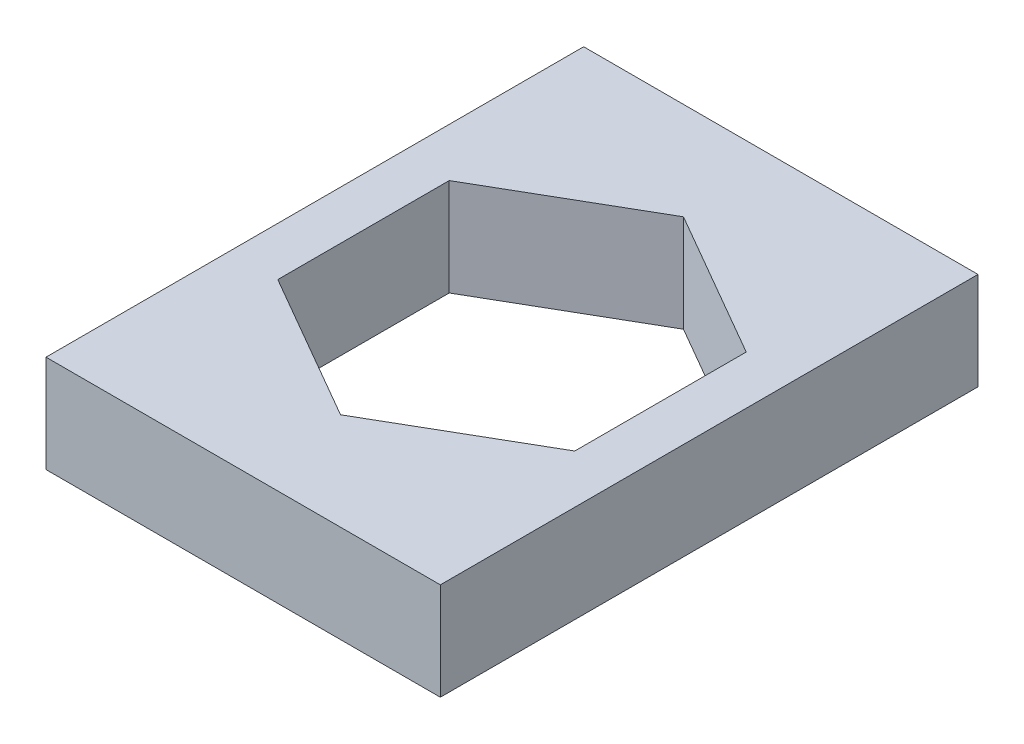
ISO-10303-21;
HEADER;
FILE_DESCRIPTION(('STEP AP214'),'2;1');
FILE_NAME('part.step','',(''),(''),'','','');
FILE_SCHEMA(('AUTOMOTIVE_DESIGN { 1 0 10303 214 1 1 1 1 }'));
ENDSEC;
DATA;
#1=APPLICATION_CONTEXT('core data for automotive mechanical design processes');
#2=APPLICATION_PROTOCOL_DEFINITION('international standard','automotive_design',2000,#1);
#3=PRODUCT_CONTEXT('',#1,'mechanical');
#4=PRODUCT('Part','Part','',(#3));
#5=PRODUCT_RELATED_PRODUCT_CATEGORY('part','',(#4));
#6=PRODUCT_DEFINITION_FORMATION('','',#4);
#7=PRODUCT_DEFINITION_CONTEXT('part definition',#1,'design');
#8=PRODUCT_DEFINITION('design','',#6,#7);
#9=PRODUCT_DEFINITION_SHAPE('','',#8);
#10=(LENGTH_UNIT() NAMED_UNIT(*) SI_UNIT(.MILLI.,.METRE.));
#11=(NAMED_UNIT(*) PLANE_ANGLE_UNIT() SI_UNIT($,.RADIAN.));
#12=(NAMED_UNIT(*) SI_UNIT($,.STERADIAN.) SOLID_ANGLE_UNIT());
#13=UNCERTAINTY_MEASURE_WITH_UNIT(LENGTH_MEASURE(1.E-05),#10,'distance_accuracy_value','');
#14=(GEOMETRIC_REPRESENTATION_CONTEXT(3) GLOBAL_UNCERTAINTY_ASSIGNED_CONTEXT((#13)) GLOBAL_UNIT_ASSIGNED_CONTEXT((#10,
#11,#12)) REPRESENTATION_CONTEXT('',''));
#15=CARTESIAN_POINT('',(0.,0.,0.));
#16=DIRECTION('',(0.,0.,1.));
#17=DIRECTION('',(1.,0.,0.));
#18=AXIS2_PLACEMENT_3D('',#15,#16,#17);
#19=CARTESIAN_POINT('',(0.,4.,0.));
#20=DIRECTION('',(0.,-1.,0.));
#21=DIRECTION('',(0.,0.,-1.));
#22=AXIS2_PLACEMENT_3D('',#19,#20,#21);
#23=PLANE('',#22);
#24=DIRECTION('',(0.,0.,1.));
#25=VECTOR('',#24,1.);
#26=CARTESIAN_POINT('',(-8.1,4.,-4.67653718043597));
#27=LINE('',#26,#25);
#28=CARTESIAN_POINT('',(-8.1,4.,-11.0436732841134));
#29=VERTEX_POINT('',#28);
#30=CARTESIAN_POINT('',(-8.1,4.,11.0436732841134));
#31=VERTEX_POINT('',#30);
#32=EDGE_CURVE('E164',#29,#31,#27,.T.);
#33=ORIENTED_EDGE('',*,*,#32,.T.);
#34=DIRECTION('',(1.,0.,0.));
#35=VECTOR('',#34,1.);
#36=CARTESIAN_POINT('',(-8.1,4.,11.0436732841134));
#37=LINE('',#36,#35);
#38=CARTESIAN_POINT('',(8.1,4.,11.0436732841134));
#39=VERTEX_POINT('',#38);
#40=EDGE_CURVE('E166',#31,#39,#37,.T.);
#41=ORIENTED_EDGE('',*,*,#40,.T.);
#42=DIRECTION('',(0.,0.,-1.));
#43=VECTOR('',#42,1.);
#44=CARTESIAN_POINT('',(8.1,4.,11.0436732841134));
#45=LINE('',#44,#43);
#46=CARTESIAN_POINT('',(8.1,4.,-11.0436732841134));
#47=VERTEX_POINT('',#46);
#48=EDGE_CURVE('E169',#39,#47,#45,.T.);
#49=ORIENTED_EDGE('',*,*,#48,.T.);
#50=DIRECTION('',(-1.,0.,0.));
#51=VECTOR('',#50,1.);
#52=CARTESIAN_POINT('',(-8.1,4.,-11.0436732841134));
#53=LINE('',#52,#51);
#54=EDGE_CURVE('E171',#47,#29,#53,.T.);
#55=ORIENTED_EDGE('',*,*,#54,.T.);
#56=EDGE_LOOP('',(#33,#41,#49,#55));
#57=FACE_BOUND('',#56,.T.);
#58=DIRECTION('',(-0.866025403784439,0.,-0.5));
#59=VECTOR('',#58,1.);
#60=CARTESIAN_POINT('',(6.1,4.,-3.52183664205672));
#61=LINE('',#60,#59);
#62=CARTESIAN_POINT('',(6.1,4.,-3.52183664205672));
#63=VERTEX_POINT('',#62);
#64=CARTESIAN_POINT('',(0.,4.,-7.04367328411343));
#65=VERTEX_POINT('',#64);
#66=EDGE_CURVE('E113',#63,#65,#61,.T.);
#67=ORIENTED_EDGE('',*,*,#66,.F.);
#68=DIRECTION('',(0.,0.,-1.));
#69=VECTOR('',#68,1.);
#70=CARTESIAN_POINT('',(6.1,4.,3.52183664205672));
#71=LINE('',#70,#69);
#72=CARTESIAN_POINT('',(6.1,4.,3.52183664205672));
#73=VERTEX_POINT('',#72);
#74=EDGE_CURVE('E142',#73,#63,#71,.T.);
#75=ORIENTED_EDGE('',*,*,#74,.F.);
#76=DIRECTION('',(0.866025403784439,0.,-0.5));
#77=VECTOR('',#76,1.);
#78=CARTESIAN_POINT('',(0.,4.,7.04367328411343));
#79=LINE('',#78,#77);
#80=CARTESIAN_POINT('',(0.,4.,7.04367328411343));
#81=VERTEX_POINT('',#80);
#82=EDGE_CURVE('E140',#81,#73,#79,.T.);
#83=ORIENTED_EDGE('',*,*,#82,.F.);
#84=DIRECTION('',(0.866025403784438,0.,0.5));
#85=VECTOR('',#84,1.);
#86=CARTESIAN_POINT('',(-6.1,4.,3.52183664205672));
#87=LINE('',#86,#85);
#88=CARTESIAN_POINT('',(-6.1,4.,3.52183664205672));
#89=VERTEX_POINT('',#88);
#90=EDGE_CURVE('E136',#89,#81,#87,.T.);
#91=ORIENTED_EDGE('',*,*,#90,.F.);
#92=DIRECTION('',(0.,0.,1.));
#93=VECTOR('',#92,1.);
#94=CARTESIAN_POINT('',(-6.1,4.,-3.52183664205672));
#95=LINE('',#94,#93);
#96=CARTESIAN_POINT('',(-6.1,4.,-3.52183664205672));
#97=VERTEX_POINT('',#96);
#98=EDGE_CURVE('E134',#97,#89,#95,.T.);
#99=ORIENTED_EDGE('',*,*,#98,.F.);
#100=DIRECTION('',(-0.866025403784439,0.,0.5));
#101=VECTOR('',#100,1.);
#102=CARTESIAN_POINT('',(0.,4.,-7.04367328411343));
#103=LINE('',#102,#101);
#104=EDGE_CURVE('E121',#65,#97,#103,.T.);
#105=ORIENTED_EDGE('',*,*,#104,.F.);
#106=EDGE_LOOP('',(#67,#75,#83,#91,#99,#105));
#107=FACE_BOUND('',#106,.T.);
#108=ADVANCED_FACE('F36',(#57,#107),#23,.F.);
#109=CARTESIAN_POINT('',(0.,0.,0.));
#110=DIRECTION('',(0.,-1.,0.));
#111=DIRECTION('',(0.,0.,-1.));
#112=AXIS2_PLACEMENT_3D('',#109,#110,#111);
#113=PLANE('',#112);
#114=DIRECTION('',(0.,0.,1.));
#115=VECTOR('',#114,1.);
#116=CARTESIAN_POINT('',(-8.1,0.,4.67653718043597));
#117=LINE('',#116,#115);
#118=CARTESIAN_POINT('',(-8.1,0.,-11.0436732841134));
#119=VERTEX_POINT('',#118);
#120=CARTESIAN_POINT('',(-8.1,0.,11.0436732841134));
#121=VERTEX_POINT('',#120);
#122=EDGE_CURVE('E129',#119,#121,#117,.T.);
#123=ORIENTED_EDGE('',*,*,#122,.F.);
#124=DIRECTION('',(-1.,0.,0.));
#125=VECTOR('',#124,1.);
#126=CARTESIAN_POINT('',(-8.1,0.,-11.0436732841134));
#127=LINE('',#126,#125);
#128=CARTESIAN_POINT('',(8.1,0.,-11.0436732841134));
#129=VERTEX_POINT('',#128);
#130=EDGE_CURVE('E167',#129,#119,#127,.T.);
#131=ORIENTED_EDGE('',*,*,#130,.F.);
#132=DIRECTION('',(0.,0.,-1.));
#133=VECTOR('',#132,1.);
#134=CARTESIAN_POINT('',(8.1,0.,-11.0436732841134));
#135=LINE('',#134,#133);
#136=CARTESIAN_POINT('',(8.1,0.,11.0436732841134));
#137=VERTEX_POINT('',#136);
#138=EDGE_CURVE('E178',#137,#129,#135,.T.);
#139=ORIENTED_EDGE('',*,*,#138,.F.);
#140=DIRECTION('',(1.,0.,0.));
#141=VECTOR('',#140,1.);
#142=CARTESIAN_POINT('',(-8.1,0.,11.0436732841134));
#143=LINE('',#142,#141);
#144=EDGE_CURVE('E175',#121,#137,#143,.T.);
#145=ORIENTED_EDGE('',*,*,#144,.F.);
#146=EDGE_LOOP('',(#123,#131,#139,#145));
#147=FACE_BOUND('',#146,.T.);
#148=DIRECTION('',(0.,0.,-1.));
#149=VECTOR('',#148,1.);
#150=CARTESIAN_POINT('',(6.1,0.,3.52183664205672));
#151=LINE('',#150,#149);
#152=CARTESIAN_POINT('',(6.1,0.,3.52183664205672));
#153=VERTEX_POINT('',#152);
#154=CARTESIAN_POINT('',(6.1,0.,-3.52183664205672));
#155=VERTEX_POINT('',#154);
#156=EDGE_CURVE('E122',#153,#155,#151,.T.);
#157=ORIENTED_EDGE('',*,*,#156,.T.);
#158=DIRECTION('',(-0.866025403784439,0.,-0.5));
#159=VECTOR('',#158,1.);
#160=CARTESIAN_POINT('',(6.1,0.,-3.52183664205672));
#161=LINE('',#160,#159);
#162=CARTESIAN_POINT('',(0.,0.,-7.04367328411343));
#163=VERTEX_POINT('',#162);
#164=EDGE_CURVE('E59',#155,#163,#161,.T.);
#165=ORIENTED_EDGE('',*,*,#164,.T.);
#166=DIRECTION('',(-0.866025403784439,0.,0.5));
#167=VECTOR('',#166,1.);
#168=CARTESIAN_POINT('',(0.,0.,-7.04367328411343));
#169=LINE('',#168,#167);
#170=CARTESIAN_POINT('',(-6.1,0.,-3.52183664205672));
#171=VERTEX_POINT('',#170);
#172=EDGE_CURVE('E128',#163,#171,#169,.T.);
#173=ORIENTED_EDGE('',*,*,#172,.T.);
#174=DIRECTION('',(0.,0.,1.));
#175=VECTOR('',#174,1.);
#176=CARTESIAN_POINT('',(-6.1,0.,-3.52183664205672));
#177=LINE('',#176,#175);
#178=CARTESIAN_POINT('',(-6.1,0.,3.52183664205672));
#179=VERTEX_POINT('',#178);
#180=EDGE_CURVE('E146',#171,#179,#177,.T.);
#181=ORIENTED_EDGE('',*,*,#180,.T.);
#182=DIRECTION('',(0.866025403784438,0.,0.5));
#183=VECTOR('',#182,1.);
#184=CARTESIAN_POINT('',(-6.1,0.,3.52183664205672));
#185=LINE('',#184,#183);
#186=CARTESIAN_POINT('',(0.,0.,7.04367328411343));
#187=VERTEX_POINT('',#186);
#188=EDGE_CURVE('E149',#179,#187,#185,.T.);
#189=ORIENTED_EDGE('',*,*,#188,.T.);
#190=DIRECTION('',(0.866025403784439,0.,-0.5));
#191=VECTOR('',#190,1.);
#192=CARTESIAN_POINT('',(0.,0.,7.04367328411343));
#193=LINE('',#192,#191);
#194=EDGE_CURVE('E152',#187,#153,#193,.T.);
#195=ORIENTED_EDGE('',*,*,#194,.T.);
#196=EDGE_LOOP('',(#157,#165,#173,#181,#189,#195));
#197=FACE_BOUND('',#196,.T.);
#198=ADVANCED_FACE('F198',(#147,#197),#113,.T.);
#199=CARTESIAN_POINT('',(-8.1,4.,4.67653718043597));
#200=DIRECTION('',(1.,0.,0.));
#201=DIRECTION('',(0.,0.,-1.));
#202=AXIS2_PLACEMENT_3D('',#199,#200,#201);
#203=PLANE('',#202);
#204=ORIENTED_EDGE('',*,*,#122,.T.);
#205=DIRECTION('',(0.,-1.,0.));
#206=VECTOR('',#205,1.);
#207=CARTESIAN_POINT('',(-8.1,4.,11.0436732841134));
#208=LINE('',#207,#206);
#209=EDGE_CURVE('E11',#31,#121,#208,.T.);
#210=ORIENTED_EDGE('',*,*,#209,.F.);
#211=ORIENTED_EDGE('',*,*,#32,.F.);
#212=DIRECTION('',(0.,-1.,0.));
#213=VECTOR('',#212,1.);
#214=CARTESIAN_POINT('',(-8.1,4.,-11.0436732841134));
#215=LINE('',#214,#213);
#216=EDGE_CURVE('E173',#29,#119,#215,.T.);
#217=ORIENTED_EDGE('',*,*,#216,.T.);
#218=EDGE_LOOP('',(#204,#210,#211,#217));
#219=FACE_BOUND('',#218,.T.);
#220=ADVANCED_FACE('F38',(#219),#203,.F.);
#221=CARTESIAN_POINT('',(-8.1,4.,11.0436732841134));
#222=DIRECTION('',(0.,0.,-1.));
#223=DIRECTION('',(-1.,0.,0.));
#224=AXIS2_PLACEMENT_3D('',#221,#222,#223);
#225=PLANE('',#224);
#226=ORIENTED_EDGE('',*,*,#144,.T.);
#227=DIRECTION('',(0.,-1.,0.));
#228=VECTOR('',#227,1.);
#229=CARTESIAN_POINT('',(8.1,4.,11.0436732841134));
#230=LINE('',#229,#228);
#231=EDGE_CURVE('E44',#39,#137,#230,.T.);
#232=ORIENTED_EDGE('',*,*,#231,.F.);
#233=ORIENTED_EDGE('',*,*,#40,.F.);
#234=ORIENTED_EDGE('',*,*,#209,.T.);
#235=EDGE_LOOP('',(#226,#232,#233,#234));
#236=FACE_BOUND('',#235,.T.);
#237=ADVANCED_FACE('F194',(#236),#225,.F.);
#238=CARTESIAN_POINT('',(8.1,4.,-11.0436732841134));
#239=DIRECTION('',(-1.,0.,0.));
#240=DIRECTION('',(0.,0.,1.));
#241=AXIS2_PLACEMENT_3D('',#238,#239,#240);
#242=PLANE('',#241);
#243=ORIENTED_EDGE('',*,*,#138,.T.);
#244=DIRECTION('',(0.,-1.,0.));
#245=VECTOR('',#244,1.);
#246=CARTESIAN_POINT('',(8.1,4.,-11.0436732841134));
#247=LINE('',#246,#245);
#248=EDGE_CURVE('E184',#47,#129,#247,.T.);
#249=ORIENTED_EDGE('',*,*,#248,.F.);
#250=ORIENTED_EDGE('',*,*,#48,.F.);
#251=ORIENTED_EDGE('',*,*,#231,.T.);
#252=EDGE_LOOP('',(#243,#249,#250,#251));
#253=FACE_BOUND('',#252,.T.);
#254=ADVANCED_FACE('F190',(#253),#242,.F.);
#255=CARTESIAN_POINT('',(-8.1,4.,-11.0436732841134));
#256=DIRECTION('',(0.,0.,1.));
#257=DIRECTION('',(1.,0.,0.));
#258=AXIS2_PLACEMENT_3D('',#255,#256,#257);
#259=PLANE('',#258);
#260=ORIENTED_EDGE('',*,*,#130,.T.);
#261=ORIENTED_EDGE('',*,*,#216,.F.);
#262=ORIENTED_EDGE('',*,*,#54,.F.);
#263=ORIENTED_EDGE('',*,*,#248,.T.);
#264=EDGE_LOOP('',(#260,#261,#262,#263));
#265=FACE_BOUND('',#264,.T.);
#266=ADVANCED_FACE('F203',(#265),#259,.F.);
#267=CARTESIAN_POINT('',(6.1,4.,-3.52183664205672));
#268=DIRECTION('',(-0.5,0.,0.866025403784439));
#269=DIRECTION('',(0.866025403784439,0.,0.5));
#270=AXIS2_PLACEMENT_3D('',#267,#268,#269);
#271=PLANE('',#270);
#272=ORIENTED_EDGE('',*,*,#164,.F.);
#273=DIRECTION('',(0.,-1.,0.));
#274=VECTOR('',#273,1.);
#275=CARTESIAN_POINT('',(6.1,4.,-3.52183664205672));
#276=LINE('',#275,#274);
#277=EDGE_CURVE('E117',#63,#155,#276,.T.);
#278=ORIENTED_EDGE('',*,*,#277,.F.);
#279=ORIENTED_EDGE('',*,*,#66,.T.);
#280=DIRECTION('',(0.,-1.,0.));
#281=VECTOR('',#280,1.);
#282=CARTESIAN_POINT('',(0.,4.,-7.04367328411343));
#283=LINE('',#282,#281);
#284=EDGE_CURVE('E116',#65,#163,#283,.T.);
#285=ORIENTED_EDGE('',*,*,#284,.T.);
#286=EDGE_LOOP('',(#272,#278,#279,#285));
#287=FACE_BOUND('',#286,.T.);
#288=ADVANCED_FACE('F115',(#287),#271,.T.);
#289=CARTESIAN_POINT('',(0.,4.,-7.04367328411343));
#290=DIRECTION('',(0.5,0.,0.866025403784439));
#291=DIRECTION('',(0.866025403784439,0.,-0.5));
#292=AXIS2_PLACEMENT_3D('',#289,#290,#291);
#293=PLANE('',#292);
#294=ORIENTED_EDGE('',*,*,#172,.F.);
#295=ORIENTED_EDGE('',*,*,#284,.F.);
#296=ORIENTED_EDGE('',*,*,#104,.T.);
#297=DIRECTION('',(0.,-1.,0.));
#298=VECTOR('',#297,1.);
#299=CARTESIAN_POINT('',(-6.1,4.,-3.52183664205672));
#300=LINE('',#299,#298);
#301=EDGE_CURVE('E130',#97,#171,#300,.T.);
#302=ORIENTED_EDGE('',*,*,#301,.T.);
#303=EDGE_LOOP('',(#294,#295,#296,#302));
#304=FACE_BOUND('',#303,.T.);
#305=ADVANCED_FACE('F125',(#304),#293,.T.);
#306=CARTESIAN_POINT('',(-6.1,4.,-3.52183664205672));
#307=DIRECTION('',(1.,0.,0.));
#308=DIRECTION('',(0.,0.,-1.));
#309=AXIS2_PLACEMENT_3D('',#306,#307,#308);
#310=PLANE('',#309);
#311=ORIENTED_EDGE('',*,*,#180,.F.);
#312=ORIENTED_EDGE('',*,*,#301,.F.);
#313=ORIENTED_EDGE('',*,*,#98,.T.);
#314=DIRECTION('',(0.,-1.,0.));
#315=VECTOR('',#314,1.);
#316=CARTESIAN_POINT('',(-6.1,4.,3.52183664205672));
#317=LINE('',#316,#315);
#318=EDGE_CURVE('E161',#89,#179,#317,.T.);
#319=ORIENTED_EDGE('',*,*,#318,.T.);
#320=EDGE_LOOP('',(#311,#312,#313,#319));
#321=FACE_BOUND('',#320,.T.);
#322=ADVANCED_FACE('F278',(#321),#310,.T.);
#323=CARTESIAN_POINT('',(-6.1,4.,3.52183664205672));
#324=DIRECTION('',(0.5,0.,-0.866025403784439));
#325=DIRECTION('',(-0.866025403784439,0.,-0.5));
#326=AXIS2_PLACEMENT_3D('',#323,#324,#325);
#327=PLANE('',#326);
#328=ORIENTED_EDGE('',*,*,#188,.F.);
#329=ORIENTED_EDGE('',*,*,#318,.F.);
#330=ORIENTED_EDGE('',*,*,#90,.T.);
#331=DIRECTION('',(0.,-1.,0.));
#332=VECTOR('',#331,1.);
#333=CARTESIAN_POINT('',(0.,4.,7.04367328411343));
#334=LINE('',#333,#332);
#335=EDGE_CURVE('E159',#81,#187,#334,.T.);
#336=ORIENTED_EDGE('',*,*,#335,.T.);
#337=EDGE_LOOP('',(#328,#329,#330,#336));
#338=FACE_BOUND('',#337,.T.);
#339=ADVANCED_FACE('F285',(#338),#327,.T.);
#340=CARTESIAN_POINT('',(0.,4.,7.04367328411343));
#341=DIRECTION('',(-0.5,0.,-0.866025403784439));
#342=DIRECTION('',(-0.866025403784439,0.,0.5));
#343=AXIS2_PLACEMENT_3D('',#340,#341,#342);
#344=PLANE('',#343);
#345=ORIENTED_EDGE('',*,*,#194,.F.);
#346=ORIENTED_EDGE('',*,*,#335,.F.);
#347=ORIENTED_EDGE('',*,*,#82,.T.);
#348=DIRECTION('',(0.,-1.,0.));
#349=VECTOR('',#348,1.);
#350=CARTESIAN_POINT('',(6.1,4.,3.52183664205672));
#351=LINE('',#350,#349);
#352=EDGE_CURVE('E51',#73,#153,#351,.T.);
#353=ORIENTED_EDGE('',*,*,#352,.T.);
#354=EDGE_LOOP('',(#345,#346,#347,#353));
#355=FACE_BOUND('',#354,.T.);
#356=ADVANCED_FACE('F294',(#355),#344,.T.);
#357=CARTESIAN_POINT('',(6.1,4.,3.52183664205672));
#358=DIRECTION('',(-1.,0.,0.));
#359=DIRECTION('',(0.,0.,1.));
#360=AXIS2_PLACEMENT_3D('',#357,#358,#359);
#361=PLANE('',#360);
#362=ORIENTED_EDGE('',*,*,#156,.F.);
#363=ORIENTED_EDGE('',*,*,#352,.F.);
#364=ORIENTED_EDGE('',*,*,#74,.T.);
#365=ORIENTED_EDGE('',*,*,#277,.T.);
#366=EDGE_LOOP('',(#362,#363,#364,#365));
#367=FACE_BOUND('',#366,.T.);
#368=ADVANCED_FACE('F303',(#367),#361,.T.);
#369=CLOSED_SHELL('',(#108,#198,#220,#237,#254,#266,#288,#305,#322,#339,#356,#368));
#370=MANIFOLD_SOLID_BREP('B2',#369);
#371=ADVANCED_BREP_SHAPE_REPRESENTATION('',(#18,#370),#14);
#372=SHAPE_DEFINITION_REPRESENTATION(#9,#371);
ENDSEC;
END-ISO-10303-21;
